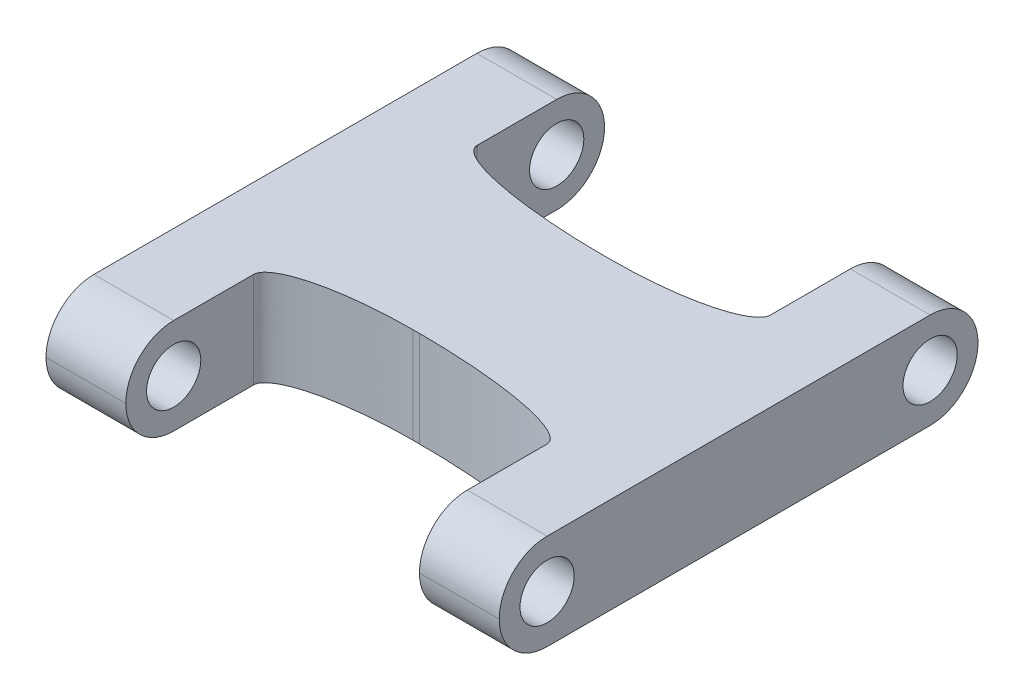
ISO-10303-21;
HEADER;
FILE_DESCRIPTION(('STEP AP214'),'2;1');
FILE_NAME('part.step','',(''),(''),'','','');
FILE_SCHEMA(('AUTOMOTIVE_DESIGN { 1 0 10303 214 1 1 1 1 }'));
ENDSEC;
DATA;
#1=APPLICATION_CONTEXT('core data for automotive mechanical design processes');
#2=APPLICATION_PROTOCOL_DEFINITION('international standard','automotive_design',2000,#1);
#3=PRODUCT_CONTEXT('',#1,'mechanical');
#4=PRODUCT('Part','Part','',(#3));
#5=PRODUCT_RELATED_PRODUCT_CATEGORY('part','',(#4));
#6=PRODUCT_DEFINITION_FORMATION('','',#4);
#7=PRODUCT_DEFINITION_CONTEXT('part definition',#1,'design');
#8=PRODUCT_DEFINITION('design','',#6,#7);
#9=PRODUCT_DEFINITION_SHAPE('','',#8);
#10=(LENGTH_UNIT() NAMED_UNIT(*) SI_UNIT(.MILLI.,.METRE.));
#11=(NAMED_UNIT(*) PLANE_ANGLE_UNIT() SI_UNIT($,.RADIAN.));
#12=(NAMED_UNIT(*) SI_UNIT($,.STERADIAN.) SOLID_ANGLE_UNIT());
#13=UNCERTAINTY_MEASURE_WITH_UNIT(LENGTH_MEASURE(1.E-05),#10,'distance_accuracy_value','');
#14=(GEOMETRIC_REPRESENTATION_CONTEXT(3) GLOBAL_UNCERTAINTY_ASSIGNED_CONTEXT((#13)) GLOBAL_UNIT_ASSIGNED_CONTEXT((#10,
#11,#12)) REPRESENTATION_CONTEXT('',''));
#15=CARTESIAN_POINT('',(0.,0.,0.));
#16=DIRECTION('',(0.,0.,1.));
#17=DIRECTION('',(1.,0.,0.));
#18=AXIS2_PLACEMENT_3D('',#15,#16,#17);
#19=CARTESIAN_POINT('',(5.,6.,-10.));
#20=DIRECTION('',(-1.,0.,0.));
#21=DIRECTION('',(0.,0.,1.));
#22=AXIS2_PLACEMENT_3D('',#19,#20,#21);
#23=PLANE('',#22);
#24=CARTESIAN_POINT('',(5.,3.,-3.00000000000001));
#25=DIRECTION('',(-1.,0.,0.));
#26=DIRECTION('',(0.,0.,1.));
#27=AXIS2_PLACEMENT_3D('',#24,#25,#26);
#28=CIRCLE('',#27,1.7);
#29=CARTESIAN_POINT('',(5.,3.,-1.3));
#30=VERTEX_POINT('',#29);
#31=EDGE_CURVE('E266',#30,#30,#28,.T.);
#32=ORIENTED_EDGE('',*,*,#31,.T.);
#33=EDGE_LOOP('',(#32));
#34=FACE_BOUND('',#33,.T.);
#35=DIRECTION('',(0.,0.,-1.));
#36=VECTOR('',#35,1.);
#37=CARTESIAN_POINT('',(5.,0.,-10.));
#38=LINE('',#37,#36);
#39=CARTESIAN_POINT('',(5.,0.,-3.));
#40=VERTEX_POINT('',#39);
#41=CARTESIAN_POINT('',(5.,0.,-8.));
#42=VERTEX_POINT('',#41);
#43=EDGE_CURVE('E256',#40,#42,#38,.T.);
#44=ORIENTED_EDGE('',*,*,#43,.T.);
#45=CARTESIAN_POINT('',(5.,6.3,-8.));
#46=CARTESIAN_POINT('',(5.,4.1,-8.));
#47=CARTESIAN_POINT('',(5.,1.9,-8.));
#48=CARTESIAN_POINT('',(5.,-0.3,-8.));
#49=(BOUNDED_CURVE() B_SPLINE_CURVE(3,(#45,#46,#47,#48),.UNSPECIFIED.,.F.,
.F.) B_SPLINE_CURVE_WITH_KNOTS((4,4),(-0.0063,0.0003),
.UNSPECIFIED.) CURVE() GEOMETRIC_REPRESENTATION_ITEM() RATIONAL_B_SPLINE_CURVE((1.,1.,1.,1.)) REPRESENTATION_ITEM(''));
#50=CARTESIAN_POINT('',(5.,6.,-8.));
#51=VERTEX_POINT('',#50);
#52=EDGE_CURVE('E339',#42,#51,#49,.F.);
#53=ORIENTED_EDGE('',*,*,#52,.T.);
#54=DIRECTION('',(0.,0.,-1.));
#55=VECTOR('',#54,1.);
#56=CARTESIAN_POINT('',(5.,6.,-10.));
#57=LINE('',#56,#55);
#58=CARTESIAN_POINT('',(5.,6.,-3.));
#59=VERTEX_POINT('',#58);
#60=EDGE_CURVE('E208',#59,#51,#57,.T.);
#61=ORIENTED_EDGE('',*,*,#60,.F.);
#62=CARTESIAN_POINT('',(5.,3.,-3.));
#63=DIRECTION('',(-1.,0.,0.));
#64=DIRECTION('',(0.,0.,1.));
#65=AXIS2_PLACEMENT_3D('',#62,#63,#64);
#66=CIRCLE('',#65,3.);
#67=CARTESIAN_POINT('',(5.,3.,0.));
#68=VERTEX_POINT('',#67);
#69=EDGE_CURVE('E244',#59,#68,#66,.F.);
#70=ORIENTED_EDGE('',*,*,#69,.T.);
#71=CARTESIAN_POINT('',(5.,3.,-3.));
#72=DIRECTION('',(-1.,0.,0.));
#73=DIRECTION('',(0.,0.,1.));
#74=AXIS2_PLACEMENT_3D('',#71,#72,#73);
#75=CIRCLE('',#74,3.);
#76=EDGE_CURVE('E246',#68,#40,#75,.F.);
#77=ORIENTED_EDGE('',*,*,#76,.T.);
#78=EDGE_LOOP('',(#44,#53,#61,#70,#77));
#79=FACE_BOUND('',#78,.T.);
#80=ADVANCED_FACE('F42',(#34,#79),#23,.F.);
#81=CARTESIAN_POINT('',(23.4,6.,-10.));
#82=DIRECTION('',(0.,0.,-1.));
#83=DIRECTION('',(-1.,0.,0.));
#84=AXIS2_PLACEMENT_3D('',#81,#82,#83);
#85=PLANE('',#84);
#86=DIRECTION('',(1.,0.,0.));
#87=VECTOR('',#86,1.);
#88=CARTESIAN_POINT('',(23.4,0.,-10.));
#89=LINE('',#88,#87);
#90=CARTESIAN_POINT('',(13.,0.,-10.));
#91=VERTEX_POINT('',#90);
#92=CARTESIAN_POINT('',(13.4,0.,-10.));
#93=VERTEX_POINT('',#92);
#94=EDGE_CURVE('E310',#91,#93,#89,.T.);
#95=ORIENTED_EDGE('',*,*,#94,.T.);
#96=CARTESIAN_POINT('',(13.4,6.3,-10.));
#97=CARTESIAN_POINT('',(13.4,4.1,-10.));
#98=CARTESIAN_POINT('',(13.4,1.9,-10.));
#99=CARTESIAN_POINT('',(13.4,-0.3,-10.));
#100=(BOUNDED_CURVE() B_SPLINE_CURVE(3,(#96,#97,#98,#99),.UNSPECIFIED.,.F.,
.F.) B_SPLINE_CURVE_WITH_KNOTS((4,4),(-0.0063,0.0003),
.UNSPECIFIED.) CURVE() GEOMETRIC_REPRESENTATION_ITEM() RATIONAL_B_SPLINE_CURVE((1.,1.,1.,1.)) REPRESENTATION_ITEM(''));
#101=CARTESIAN_POINT('',(13.4,6.,-10.));
#102=VERTEX_POINT('',#101);
#103=EDGE_CURVE('E70',#93,#102,#100,.F.);
#104=ORIENTED_EDGE('',*,*,#103,.T.);
#105=DIRECTION('',(1.,0.,0.));
#106=VECTOR('',#105,1.);
#107=CARTESIAN_POINT('',(23.4,6.,-10.));
#108=LINE('',#107,#106);
#109=CARTESIAN_POINT('',(13.,6.,-10.));
#110=VERTEX_POINT('',#109);
#111=EDGE_CURVE('E318',#110,#102,#108,.T.);
#112=ORIENTED_EDGE('',*,*,#111,.F.);
#113=CARTESIAN_POINT('',(13.,-0.3,-10.));
#114=CARTESIAN_POINT('',(13.,1.9,-10.));
#115=CARTESIAN_POINT('',(13.,4.1,-10.));
#116=CARTESIAN_POINT('',(13.,6.3,-10.));
#117=(BOUNDED_CURVE() B_SPLINE_CURVE(3,(#113,#114,#115,#116),.UNSPECIFIED.,.F.,
.F.) B_SPLINE_CURVE_WITH_KNOTS((4,4),(-0.0063,0.0003),
.UNSPECIFIED.) CURVE() GEOMETRIC_REPRESENTATION_ITEM() RATIONAL_B_SPLINE_CURVE((1.,1.,1.,1.)) REPRESENTATION_ITEM(''));
#118=EDGE_CURVE('E334',#110,#91,#117,.F.);
#119=ORIENTED_EDGE('',*,*,#118,.T.);
#120=EDGE_LOOP('',(#95,#104,#112,#119));
#121=FACE_BOUND('',#120,.T.);
#122=ADVANCED_FACE('F335',(#121),#85,.F.);
#123=CARTESIAN_POINT('',(23.4,6.,0.));
#124=DIRECTION('',(1.,0.,0.));
#125=DIRECTION('',(0.,0.,-1.));
#126=AXIS2_PLACEMENT_3D('',#123,#124,#125);
#127=PLANE('',#126);
#128=CARTESIAN_POINT('',(23.4,3.,-3.));
#129=DIRECTION('',(1.,0.,0.));
#130=DIRECTION('',(0.,0.,-1.));
#131=AXIS2_PLACEMENT_3D('',#128,#129,#130);
#132=CIRCLE('',#131,1.7);
#133=CARTESIAN_POINT('',(23.4,3.,-4.7));
#134=VERTEX_POINT('',#133);
#135=EDGE_CURVE('E693',#134,#134,#132,.T.);
#136=ORIENTED_EDGE('',*,*,#135,.T.);
#137=EDGE_LOOP('',(#136));
#138=FACE_BOUND('',#137,.T.);
#139=DIRECTION('',(0.,0.,1.));
#140=VECTOR('',#139,1.);
#141=CARTESIAN_POINT('',(23.4,6.,0.));
#142=LINE('',#141,#140);
#143=CARTESIAN_POINT('',(23.4,6.,-8.));
#144=VERTEX_POINT('',#143);
#145=CARTESIAN_POINT('',(23.4,6.,-3.));
#146=VERTEX_POINT('',#145);
#147=EDGE_CURVE('E330',#144,#146,#142,.T.);
#148=ORIENTED_EDGE('',*,*,#147,.F.);
#149=CARTESIAN_POINT('',(23.4,-0.3,-8.));
#150=CARTESIAN_POINT('',(23.4,1.9,-8.));
#151=CARTESIAN_POINT('',(23.4,4.1,-8.));
#152=CARTESIAN_POINT('',(23.4,6.3,-8.));
#153=(BOUNDED_CURVE() B_SPLINE_CURVE(3,(#149,#150,#151,#152),.UNSPECIFIED.,.F.,
.F.) B_SPLINE_CURVE_WITH_KNOTS((4,4),(-0.0063,0.0003),
.UNSPECIFIED.) CURVE() GEOMETRIC_REPRESENTATION_ITEM() RATIONAL_B_SPLINE_CURVE((1.,1.,1.,1.)) REPRESENTATION_ITEM(''));
#154=CARTESIAN_POINT('',(23.4,0.,-8.));
#155=VERTEX_POINT('',#154);
#156=EDGE_CURVE('E362',#144,#155,#153,.F.);
#157=ORIENTED_EDGE('',*,*,#156,.T.);
#158=DIRECTION('',(0.,0.,1.));
#159=VECTOR('',#158,1.);
#160=CARTESIAN_POINT('',(23.4,0.,0.));
#161=LINE('',#160,#159);
#162=CARTESIAN_POINT('',(23.4,0.,-3.));
#163=VERTEX_POINT('',#162);
#164=EDGE_CURVE('E343',#155,#163,#161,.T.);
#165=ORIENTED_EDGE('',*,*,#164,.T.);
#166=CARTESIAN_POINT('',(23.4,3.,-3.));
#167=DIRECTION('',(1.,0.,0.));
#168=DIRECTION('',(0.,0.,-1.));
#169=AXIS2_PLACEMENT_3D('',#166,#167,#168);
#170=CIRCLE('',#169,3.);
#171=CARTESIAN_POINT('',(23.4,3.,0.));
#172=VERTEX_POINT('',#171);
#173=EDGE_CURVE('E251',#163,#172,#170,.F.);
#174=ORIENTED_EDGE('',*,*,#173,.T.);
#175=CARTESIAN_POINT('',(23.4,3.,-3.));
#176=DIRECTION('',(1.,0.,0.));
#177=DIRECTION('',(0.,0.,-1.));
#178=AXIS2_PLACEMENT_3D('',#175,#176,#177);
#179=CIRCLE('',#178,3.);
#180=EDGE_CURVE('E248',#172,#146,#179,.F.);
#181=ORIENTED_EDGE('',*,*,#180,.T.);
#182=EDGE_LOOP('',(#148,#157,#165,#174,#181));
#183=FACE_BOUND('',#182,.T.);
#184=ADVANCED_FACE('F367',(#138,#183),#127,.F.);
#185=CARTESIAN_POINT('',(28.4,6.,-30.));
#186=DIRECTION('',(-1.,0.,0.));
#187=DIRECTION('',(0.,0.,1.));
#188=AXIS2_PLACEMENT_3D('',#185,#186,#187);
#189=PLANE('',#188);
#190=CARTESIAN_POINT('',(28.4,3.,-3.));
#191=DIRECTION('',(1.,0.,0.));
#192=DIRECTION('',(0.,0.,-1.));
#193=AXIS2_PLACEMENT_3D('',#190,#191,#192);
#194=CIRCLE('',#193,1.7);
#195=CARTESIAN_POINT('',(28.4,3.,-4.7));
#196=VERTEX_POINT('',#195);
#197=EDGE_CURVE('E710',#196,#196,#194,.T.);
#198=ORIENTED_EDGE('',*,*,#197,.F.);
#199=EDGE_LOOP('',(#198));
#200=FACE_BOUND('',#199,.T.);
#201=CARTESIAN_POINT('',(28.4,3.,-27.));
#202=DIRECTION('',(1.,0.,0.));
#203=DIRECTION('',(0.,0.,-1.));
#204=AXIS2_PLACEMENT_3D('',#201,#202,#203);
#205=CIRCLE('',#204,1.7);
#206=CARTESIAN_POINT('',(28.4,3.,-28.7));
#207=VERTEX_POINT('',#206);
#208=EDGE_CURVE('E707',#207,#207,#205,.T.);
#209=ORIENTED_EDGE('',*,*,#208,.F.);
#210=EDGE_LOOP('',(#209));
#211=FACE_BOUND('',#210,.T.);
#212=DIRECTION('',(0.,0.,-1.));
#213=VECTOR('',#212,1.);
#214=CARTESIAN_POINT('',(28.4,0.,-30.));
#215=LINE('',#214,#213);
#216=CARTESIAN_POINT('',(28.4,0.,-3.));
#217=VERTEX_POINT('',#216);
#218=CARTESIAN_POINT('',(28.4,0.,-27.));
#219=VERTEX_POINT('',#218);
#220=EDGE_CURVE('E344',#217,#219,#215,.T.);
#221=ORIENTED_EDGE('',*,*,#220,.T.);
#222=CARTESIAN_POINT('',(28.4,3.,-27.));
#223=DIRECTION('',(-1.,0.,0.));
#224=DIRECTION('',(0.,0.,1.));
#225=AXIS2_PLACEMENT_3D('',#222,#223,#224);
#226=CIRCLE('',#225,3.);
#227=CARTESIAN_POINT('',(28.4,3.,-30.));
#228=VERTEX_POINT('',#227);
#229=EDGE_CURVE('E242',#219,#228,#226,.F.);
#230=ORIENTED_EDGE('',*,*,#229,.T.);
#231=CARTESIAN_POINT('',(28.4,3.,-27.));
#232=DIRECTION('',(-1.,0.,0.));
#233=DIRECTION('',(0.,0.,1.));
#234=AXIS2_PLACEMENT_3D('',#231,#232,#233);
#235=CIRCLE('',#234,3.);
#236=CARTESIAN_POINT('',(28.4,6.,-27.));
#237=VERTEX_POINT('',#236);
#238=EDGE_CURVE('E240',#228,#237,#235,.F.);
#239=ORIENTED_EDGE('',*,*,#238,.T.);
#240=DIRECTION('',(0.,0.,-1.));
#241=VECTOR('',#240,1.);
#242=CARTESIAN_POINT('',(28.4,6.,-30.));
#243=LINE('',#242,#241);
#244=CARTESIAN_POINT('',(28.4,6.,-3.));
#245=VERTEX_POINT('',#244);
#246=EDGE_CURVE('E358',#245,#237,#243,.T.);
#247=ORIENTED_EDGE('',*,*,#246,.F.);
#248=CARTESIAN_POINT('',(28.4,3.,-3.));
#249=DIRECTION('',(-1.,0.,0.));
#250=DIRECTION('',(0.,0.,1.));
#251=AXIS2_PLACEMENT_3D('',#248,#249,#250);
#252=CIRCLE('',#251,3.);
#253=CARTESIAN_POINT('',(28.4,3.,0.));
#254=VERTEX_POINT('',#253);
#255=EDGE_CURVE('E236',#245,#254,#252,.F.);
#256=ORIENTED_EDGE('',*,*,#255,.T.);
#257=CARTESIAN_POINT('',(28.4,3.,-3.));
#258=DIRECTION('',(-1.,0.,0.));
#259=DIRECTION('',(0.,0.,1.));
#260=AXIS2_PLACEMENT_3D('',#257,#258,#259);
#261=CIRCLE('',#260,3.);
#262=EDGE_CURVE('E238',#254,#217,#261,.F.);
#263=ORIENTED_EDGE('',*,*,#262,.T.);
#264=EDGE_LOOP('',(#221,#230,#239,#247,#256,#263));
#265=FACE_BOUND('',#264,.T.);
#266=ADVANCED_FACE('F376',(#200,#211,#265),#189,.F.);
#267=CARTESIAN_POINT('',(23.4,6.,-20.));
#268=DIRECTION('',(1.,0.,0.));
#269=DIRECTION('',(0.,0.,-1.));
#270=AXIS2_PLACEMENT_3D('',#267,#268,#269);
#271=PLANE('',#270);
#272=CARTESIAN_POINT('',(23.4,3.,-27.));
#273=DIRECTION('',(1.,0.,0.));
#274=DIRECTION('',(0.,0.,-1.));
#275=AXIS2_PLACEMENT_3D('',#272,#273,#274);
#276=CIRCLE('',#275,1.7);
#277=CARTESIAN_POINT('',(23.4,3.,-28.7));
#278=VERTEX_POINT('',#277);
#279=EDGE_CURVE('E695',#278,#278,#276,.T.);
#280=ORIENTED_EDGE('',*,*,#279,.T.);
#281=EDGE_LOOP('',(#280));
#282=FACE_BOUND('',#281,.T.);
#283=DIRECTION('',(0.,0.,1.));
#284=VECTOR('',#283,1.);
#285=CARTESIAN_POINT('',(23.4,0.,-20.));
#286=LINE('',#285,#284);
#287=CARTESIAN_POINT('',(23.4,0.,-27.));
#288=VERTEX_POINT('',#287);
#289=CARTESIAN_POINT('',(23.4,0.,-22.));
#290=VERTEX_POINT('',#289);
#291=EDGE_CURVE('E271',#288,#290,#286,.T.);
#292=ORIENTED_EDGE('',*,*,#291,.T.);
#293=CARTESIAN_POINT('',(23.4,6.3,-22.));
#294=CARTESIAN_POINT('',(23.4,4.1,-22.));
#295=CARTESIAN_POINT('',(23.4,1.9,-22.));
#296=CARTESIAN_POINT('',(23.4,-0.3,-22.));
#297=(BOUNDED_CURVE() B_SPLINE_CURVE(3,(#293,#294,#295,#296),.UNSPECIFIED.,.F.,
.F.) B_SPLINE_CURVE_WITH_KNOTS((4,4),(-0.0063,0.0003),
.UNSPECIFIED.) CURVE() GEOMETRIC_REPRESENTATION_ITEM() RATIONAL_B_SPLINE_CURVE((1.,1.,1.,1.)) REPRESENTATION_ITEM(''));
#298=CARTESIAN_POINT('',(23.4,6.,-22.));
#299=VERTEX_POINT('',#298);
#300=EDGE_CURVE('E340',#290,#299,#297,.F.);
#301=ORIENTED_EDGE('',*,*,#300,.T.);
#302=DIRECTION('',(0.,0.,1.));
#303=VECTOR('',#302,1.);
#304=CARTESIAN_POINT('',(23.4,6.,-20.));
#305=LINE('',#304,#303);
#306=CARTESIAN_POINT('',(23.4,6.,-27.));
#307=VERTEX_POINT('',#306);
#308=EDGE_CURVE('E449',#307,#299,#305,.T.);
#309=ORIENTED_EDGE('',*,*,#308,.F.);
#310=CARTESIAN_POINT('',(23.4,3.,-27.));
#311=DIRECTION('',(1.,0.,0.));
#312=DIRECTION('',(0.,0.,-1.));
#313=AXIS2_PLACEMENT_3D('',#310,#311,#312);
#314=CIRCLE('',#313,3.);
#315=CARTESIAN_POINT('',(23.4,3.,-30.));
#316=VERTEX_POINT('',#315);
#317=EDGE_CURVE('E232',#307,#316,#314,.F.);
#318=ORIENTED_EDGE('',*,*,#317,.T.);
#319=CARTESIAN_POINT('',(23.4,3.,-27.));
#320=DIRECTION('',(1.,0.,0.));
#321=DIRECTION('',(0.,0.,-1.));
#322=AXIS2_PLACEMENT_3D('',#319,#320,#321);
#323=CIRCLE('',#322,3.);
#324=EDGE_CURVE('E234',#316,#288,#323,.F.);
#325=ORIENTED_EDGE('',*,*,#324,.T.);
#326=EDGE_LOOP('',(#292,#301,#309,#318,#325));
#327=FACE_BOUND('',#326,.T.);
#328=ADVANCED_FACE('F550',(#282,#327),#271,.F.);
#329=CARTESIAN_POINT('',(5.,6.,-20.));
#330=DIRECTION('',(0.,0.,1.));
#331=DIRECTION('',(1.,0.,0.));
#332=AXIS2_PLACEMENT_3D('',#329,#330,#331);
#333=PLANE('',#332);
#334=DIRECTION('',(-1.,0.,0.));
#335=VECTOR('',#334,1.);
#336=CARTESIAN_POINT('',(5.,0.,-20.));
#337=LINE('',#336,#335);
#338=CARTESIAN_POINT('',(15.4,0.,-20.));
#339=VERTEX_POINT('',#338);
#340=CARTESIAN_POINT('',(15.,0.,-20.));
#341=VERTEX_POINT('',#340);
#342=EDGE_CURVE('E267',#339,#341,#337,.T.);
#343=ORIENTED_EDGE('',*,*,#342,.T.);
#344=CARTESIAN_POINT('',(15.,6.3,-20.));
#345=CARTESIAN_POINT('',(15.,4.1,-20.));
#346=CARTESIAN_POINT('',(15.,1.9,-20.));
#347=CARTESIAN_POINT('',(15.,-0.3,-20.));
#348=(BOUNDED_CURVE() B_SPLINE_CURVE(3,(#344,#345,#346,#347),.UNSPECIFIED.,.F.,
.F.) B_SPLINE_CURVE_WITH_KNOTS((4,4),(-0.0063,0.0003),
.UNSPECIFIED.) CURVE() GEOMETRIC_REPRESENTATION_ITEM() RATIONAL_B_SPLINE_CURVE((1.,1.,1.,1.)) REPRESENTATION_ITEM(''));
#349=CARTESIAN_POINT('',(15.,6.,-20.));
#350=VERTEX_POINT('',#349);
#351=EDGE_CURVE('E459',#341,#350,#348,.F.);
#352=ORIENTED_EDGE('',*,*,#351,.T.);
#353=DIRECTION('',(-1.,0.,0.));
#354=VECTOR('',#353,1.);
#355=CARTESIAN_POINT('',(5.,6.,-20.));
#356=LINE('',#355,#354);
#357=CARTESIAN_POINT('',(15.4,6.,-20.));
#358=VERTEX_POINT('',#357);
#359=EDGE_CURVE('E272',#358,#350,#356,.T.);
#360=ORIENTED_EDGE('',*,*,#359,.F.);
#361=CARTESIAN_POINT('',(15.4,-0.3,-20.));
#362=CARTESIAN_POINT('',(15.4,1.9,-20.));
#363=CARTESIAN_POINT('',(15.4,4.1,-20.));
#364=CARTESIAN_POINT('',(15.4,6.3,-20.));
#365=(BOUNDED_CURVE() B_SPLINE_CURVE(3,(#361,#362,#363,#364),.UNSPECIFIED.,.F.,
.F.) B_SPLINE_CURVE_WITH_KNOTS((4,4),(-0.0063,0.0003),
.UNSPECIFIED.) CURVE() GEOMETRIC_REPRESENTATION_ITEM() RATIONAL_B_SPLINE_CURVE((1.,1.,1.,1.)) REPRESENTATION_ITEM(''));
#366=EDGE_CURVE('E253',#358,#339,#365,.F.);
#367=ORIENTED_EDGE('',*,*,#366,.T.);
#368=EDGE_LOOP('',(#343,#352,#360,#367));
#369=FACE_BOUND('',#368,.T.);
#370=ADVANCED_FACE('F457',(#369),#333,.F.);
#371=CARTESIAN_POINT('',(5.,6.,-30.));
#372=DIRECTION('',(-1.,0.,0.));
#373=DIRECTION('',(0.,0.,1.));
#374=AXIS2_PLACEMENT_3D('',#371,#372,#373);
#375=PLANE('',#374);
#376=CARTESIAN_POINT('',(5.,3.,-27.));
#377=DIRECTION('',(-1.,0.,0.));
#378=DIRECTION('',(0.,0.,1.));
#379=AXIS2_PLACEMENT_3D('',#376,#377,#378);
#380=CIRCLE('',#379,1.7);
#381=CARTESIAN_POINT('',(5.,3.,-25.3));
#382=VERTEX_POINT('',#381);
#383=EDGE_CURVE('E698',#382,#382,#380,.T.);
#384=ORIENTED_EDGE('',*,*,#383,.T.);
#385=EDGE_LOOP('',(#384));
#386=FACE_BOUND('',#385,.T.);
#387=DIRECTION('',(0.,0.,-1.));
#388=VECTOR('',#387,1.);
#389=CARTESIAN_POINT('',(5.,6.,-30.));
#390=LINE('',#389,#388);
#391=CARTESIAN_POINT('',(5.,6.,-22.));
#392=VERTEX_POINT('',#391);
#393=CARTESIAN_POINT('',(5.,6.,-27.));
#394=VERTEX_POINT('',#393);
#395=EDGE_CURVE('E289',#392,#394,#390,.T.);
#396=ORIENTED_EDGE('',*,*,#395,.F.);
#397=CARTESIAN_POINT('',(5.,-0.3,-22.));
#398=CARTESIAN_POINT('',(5.,1.9,-22.));
#399=CARTESIAN_POINT('',(5.,4.1,-22.));
#400=CARTESIAN_POINT('',(5.,6.3,-22.));
#401=(BOUNDED_CURVE() B_SPLINE_CURVE(3,(#397,#398,#399,#400),.UNSPECIFIED.,.F.,
.F.) B_SPLINE_CURVE_WITH_KNOTS((4,4),(-0.0063,0.0003),
.UNSPECIFIED.) CURVE() GEOMETRIC_REPRESENTATION_ITEM() RATIONAL_B_SPLINE_CURVE((1.,1.,1.,1.)) REPRESENTATION_ITEM(''));
#402=CARTESIAN_POINT('',(5.,0.,-22.));
#403=VERTEX_POINT('',#402);
#404=EDGE_CURVE('E592',#392,#403,#401,.F.);
#405=ORIENTED_EDGE('',*,*,#404,.T.);
#406=DIRECTION('',(0.,0.,-1.));
#407=VECTOR('',#406,1.);
#408=CARTESIAN_POINT('',(5.,0.,-30.));
#409=LINE('',#408,#407);
#410=CARTESIAN_POINT('',(5.,0.,-27.));
#411=VERTEX_POINT('',#410);
#412=EDGE_CURVE('E209',#403,#411,#409,.T.);
#413=ORIENTED_EDGE('',*,*,#412,.T.);
#414=CARTESIAN_POINT('',(5.,3.,-27.));
#415=DIRECTION('',(-1.,0.,0.));
#416=DIRECTION('',(0.,0.,1.));
#417=AXIS2_PLACEMENT_3D('',#414,#415,#416);
#418=CIRCLE('',#417,3.);
#419=CARTESIAN_POINT('',(5.,3.,-30.));
#420=VERTEX_POINT('',#419);
#421=EDGE_CURVE('E213',#411,#420,#418,.F.);
#422=ORIENTED_EDGE('',*,*,#421,.T.);
#423=CARTESIAN_POINT('',(5.,3.,-27.));
#424=DIRECTION('',(-1.,0.,0.));
#425=DIRECTION('',(0.,0.,1.));
#426=AXIS2_PLACEMENT_3D('',#423,#424,#425);
#427=CIRCLE('',#426,3.);
#428=EDGE_CURVE('E214',#420,#394,#427,.F.);
#429=ORIENTED_EDGE('',*,*,#428,.T.);
#430=EDGE_LOOP('',(#396,#405,#413,#422,#429));
#431=FACE_BOUND('',#430,.T.);
#432=ADVANCED_FACE('F607',(#386,#431),#375,.F.);
#433=CARTESIAN_POINT('',(0.,6.,0.));
#434=DIRECTION('',(1.,0.,0.));
#435=DIRECTION('',(0.,0.,-1.));
#436=AXIS2_PLACEMENT_3D('',#433,#434,#435);
#437=PLANE('',#436);
#438=CARTESIAN_POINT('',(0.,3.,-3.00000000000001));
#439=DIRECTION('',(1.,0.,0.));
#440=DIRECTION('',(0.,0.,-1.));
#441=AXIS2_PLACEMENT_3D('',#438,#439,#440);
#442=CIRCLE('',#441,1.7);
#443=CARTESIAN_POINT('',(0.,3.,-4.70000000000001));
#444=VERTEX_POINT('',#443);
#445=EDGE_CURVE('E703',#444,#444,#442,.T.);
#446=ORIENTED_EDGE('',*,*,#445,.T.);
#447=EDGE_LOOP('',(#446));
#448=FACE_BOUND('',#447,.T.);
#449=CARTESIAN_POINT('',(0.,3.,-27.));
#450=DIRECTION('',(1.,0.,0.));
#451=DIRECTION('',(0.,0.,-1.));
#452=AXIS2_PLACEMENT_3D('',#449,#450,#451);
#453=CIRCLE('',#452,1.7);
#454=CARTESIAN_POINT('',(0.,3.,-28.7));
#455=VERTEX_POINT('',#454);
#456=EDGE_CURVE('E704',#455,#455,#453,.T.);
#457=ORIENTED_EDGE('',*,*,#456,.T.);
#458=EDGE_LOOP('',(#457));
#459=FACE_BOUND('',#458,.T.);
#460=CARTESIAN_POINT('',(0.,3.,-27.));
#461=DIRECTION('',(1.,0.,0.));
#462=DIRECTION('',(0.,0.,-1.));
#463=AXIS2_PLACEMENT_3D('',#460,#461,#462);
#464=CIRCLE('',#463,3.);
#465=CARTESIAN_POINT('',(0.,6.,-27.));
#466=VERTEX_POINT('',#465);
#467=CARTESIAN_POINT('',(0.,3.,-30.));
#468=VERTEX_POINT('',#467);
#469=EDGE_CURVE('E193',#466,#468,#464,.F.);
#470=ORIENTED_EDGE('',*,*,#469,.T.);
#471=CARTESIAN_POINT('',(0.,3.,-27.));
#472=DIRECTION('',(1.,0.,0.));
#473=DIRECTION('',(0.,0.,-1.));
#474=AXIS2_PLACEMENT_3D('',#471,#472,#473);
#475=CIRCLE('',#474,3.);
#476=CARTESIAN_POINT('',(0.,0.,-27.));
#477=VERTEX_POINT('',#476);
#478=EDGE_CURVE('E187',#468,#477,#475,.F.);
#479=ORIENTED_EDGE('',*,*,#478,.T.);
#480=DIRECTION('',(0.,0.,1.));
#481=VECTOR('',#480,1.);
#482=CARTESIAN_POINT('',(0.,0.,0.));
#483=LINE('',#482,#481);
#484=CARTESIAN_POINT('',(0.,0.,-3.));
#485=VERTEX_POINT('',#484);
#486=EDGE_CURVE('E190',#477,#485,#483,.T.);
#487=ORIENTED_EDGE('',*,*,#486,.T.);
#488=CARTESIAN_POINT('',(0.,3.,-3.));
#489=DIRECTION('',(1.,0.,0.));
#490=DIRECTION('',(0.,0.,-1.));
#491=AXIS2_PLACEMENT_3D('',#488,#489,#490);
#492=CIRCLE('',#491,3.);
#493=CARTESIAN_POINT('',(0.,3.,0.));
#494=VERTEX_POINT('',#493);
#495=EDGE_CURVE('E582',#485,#494,#492,.F.);
#496=ORIENTED_EDGE('',*,*,#495,.T.);
#497=CARTESIAN_POINT('',(0.,3.,-3.));
#498=DIRECTION('',(1.,0.,0.));
#499=DIRECTION('',(0.,0.,-1.));
#500=AXIS2_PLACEMENT_3D('',#497,#498,#499);
#501=CIRCLE('',#500,3.);
#502=CARTESIAN_POINT('',(0.,6.,-3.));
#503=VERTEX_POINT('',#502);
#504=EDGE_CURVE('E301',#494,#503,#501,.F.);
#505=ORIENTED_EDGE('',*,*,#504,.T.);
#506=DIRECTION('',(0.,0.,1.));
#507=VECTOR('',#506,1.);
#508=CARTESIAN_POINT('',(0.,6.,0.));
#509=LINE('',#508,#507);
#510=EDGE_CURVE('E292',#466,#503,#509,.T.);
#511=ORIENTED_EDGE('',*,*,#510,.F.);
#512=EDGE_LOOP('',(#470,#479,#487,#496,#505,#511));
#513=FACE_BOUND('',#512,.T.);
#514=ADVANCED_FACE('F189',(#448,#459,#513),#437,.F.);
#515=CARTESIAN_POINT('',(0.,6.,0.));
#516=DIRECTION('',(0.,-1.,0.));
#517=DIRECTION('',(0.,0.,-1.));
#518=AXIS2_PLACEMENT_3D('',#515,#516,#517);
#519=PLANE('',#518);
#520=ORIENTED_EDGE('',*,*,#359,.T.);
#521=CARTESIAN_POINT('',(5.,6.,-22.));
#522=CARTESIAN_POINT('',(5.,6.,-20.));
#523=CARTESIAN_POINT('',(15.,6.,-20.));
#524=(BOUNDED_CURVE() B_SPLINE_CURVE(2,(#521,#522,#523),.UNSPECIFIED.,.F.,
.F.) B_SPLINE_CURVE_WITH_KNOTS((3,3),(0.,1.),
.UNSPECIFIED.) CURVE() GEOMETRIC_REPRESENTATION_ITEM() RATIONAL_B_SPLINE_CURVE((1.,
0.707106781186548,1.)) REPRESENTATION_ITEM(''));
#525=EDGE_CURVE('E604',#350,#392,#524,.F.);
#526=ORIENTED_EDGE('',*,*,#525,.T.);
#527=ORIENTED_EDGE('',*,*,#395,.T.);
#528=DIRECTION('',(-1.,0.,0.));
#529=VECTOR('',#528,1.);
#530=CARTESIAN_POINT('',(0.,6.,-27.));
#531=LINE('',#530,#529);
#532=EDGE_CURVE('E230',#394,#466,#531,.T.);
#533=ORIENTED_EDGE('',*,*,#532,.T.);
#534=ORIENTED_EDGE('',*,*,#510,.T.);
#535=DIRECTION('',(1.,0.,0.));
#536=VECTOR('',#535,1.);
#537=CARTESIAN_POINT('',(0.,6.,-3.));
#538=LINE('',#537,#536);
#539=EDGE_CURVE('E226',#503,#59,#538,.T.);
#540=ORIENTED_EDGE('',*,*,#539,.T.);
#541=ORIENTED_EDGE('',*,*,#60,.T.);
#542=CARTESIAN_POINT('',(13.,6.,-10.));
#543=CARTESIAN_POINT('',(5.,6.,-9.99999999999999));
#544=CARTESIAN_POINT('',(5.,6.,-8.));
#545=(BOUNDED_CURVE() B_SPLINE_CURVE(2,(#542,#543,#544),.UNSPECIFIED.,.F.,
.F.) B_SPLINE_CURVE_WITH_KNOTS((3,3),(0.,1.),
.UNSPECIFIED.) CURVE() GEOMETRIC_REPRESENTATION_ITEM() RATIONAL_B_SPLINE_CURVE((1.,
0.707106781186548,1.)) REPRESENTATION_ITEM(''));
#546=EDGE_CURVE('E536',#51,#110,#545,.F.);
#547=ORIENTED_EDGE('',*,*,#546,.T.);
#548=ORIENTED_EDGE('',*,*,#111,.T.);
#549=CARTESIAN_POINT('',(23.4,6.,-8.));
#550=CARTESIAN_POINT('',(23.4,6.,-10.));
#551=CARTESIAN_POINT('',(13.4,6.,-10.));
#552=(BOUNDED_CURVE() B_SPLINE_CURVE(2,(#549,#550,#551),.UNSPECIFIED.,.F.,
.F.) B_SPLINE_CURVE_WITH_KNOTS((3,3),(0.,1.),
.UNSPECIFIED.) CURVE() GEOMETRIC_REPRESENTATION_ITEM() RATIONAL_B_SPLINE_CURVE((1.,
0.707106781186548,1.)) REPRESENTATION_ITEM(''));
#553=EDGE_CURVE('E12',#102,#144,#552,.F.);
#554=ORIENTED_EDGE('',*,*,#553,.T.);
#555=ORIENTED_EDGE('',*,*,#147,.T.);
#556=DIRECTION('',(1.,0.,0.));
#557=VECTOR('',#556,1.);
#558=CARTESIAN_POINT('',(0.,6.,-3.));
#559=LINE('',#558,#557);
#560=EDGE_CURVE('E224',#146,#245,#559,.T.);
#561=ORIENTED_EDGE('',*,*,#560,.T.);
#562=ORIENTED_EDGE('',*,*,#246,.T.);
#563=DIRECTION('',(-1.,0.,0.));
#564=VECTOR('',#563,1.);
#565=CARTESIAN_POINT('',(0.,6.,-27.));
#566=LINE('',#565,#564);
#567=EDGE_CURVE('E228',#237,#307,#566,.T.);
#568=ORIENTED_EDGE('',*,*,#567,.T.);
#569=ORIENTED_EDGE('',*,*,#308,.T.);
#570=CARTESIAN_POINT('',(15.4,6.,-20.));
#571=CARTESIAN_POINT('',(23.4,6.,-20.));
#572=CARTESIAN_POINT('',(23.4,6.,-22.));
#573=(BOUNDED_CURVE() B_SPLINE_CURVE(2,(#570,#571,#572),.UNSPECIFIED.,.F.,
.F.) B_SPLINE_CURVE_WITH_KNOTS((3,3),(0.,1.),
.UNSPECIFIED.) CURVE() GEOMETRIC_REPRESENTATION_ITEM() RATIONAL_B_SPLINE_CURVE((1.,
0.707106781186547,1.)) REPRESENTATION_ITEM(''));
#574=EDGE_CURVE('E438',#299,#358,#573,.F.);
#575=ORIENTED_EDGE('',*,*,#574,.T.);
#576=EDGE_LOOP('',(#520,#526,#527,#533,#534,#540,#541,#547,#548,#554,#555,#561,#562,#568,#569,#575));
#577=FACE_BOUND('',#576,.T.);
#578=ADVANCED_FACE('F411',(#577),#519,.F.);
#579=CARTESIAN_POINT('',(0.,0.,0.));
#580=DIRECTION('',(0.,-1.,0.));
#581=DIRECTION('',(0.,0.,-1.));
#582=AXIS2_PLACEMENT_3D('',#579,#580,#581);
#583=PLANE('',#582);
#584=ORIENTED_EDGE('',*,*,#486,.F.);
#585=DIRECTION('',(-1.,0.,0.));
#586=VECTOR('',#585,1.);
#587=CARTESIAN_POINT('',(5.,0.,-27.));
#588=LINE('',#587,#586);
#589=EDGE_CURVE('E204',#477,#411,#588,.F.);
#590=ORIENTED_EDGE('',*,*,#589,.T.);
#591=ORIENTED_EDGE('',*,*,#412,.F.);
#592=CARTESIAN_POINT('',(15.,0.,-20.));
#593=CARTESIAN_POINT('',(5.,0.,-20.));
#594=CARTESIAN_POINT('',(5.,0.,-22.));
#595=(BOUNDED_CURVE() B_SPLINE_CURVE(2,(#592,#593,#594),.UNSPECIFIED.,.F.,
.F.) B_SPLINE_CURVE_WITH_KNOTS((3,3),(0.,1.),
.UNSPECIFIED.) CURVE() GEOMETRIC_REPRESENTATION_ITEM() RATIONAL_B_SPLINE_CURVE((1.,
0.707106781186548,1.)) REPRESENTATION_ITEM(''));
#596=EDGE_CURVE('E395',#403,#341,#595,.F.);
#597=ORIENTED_EDGE('',*,*,#596,.T.);
#598=ORIENTED_EDGE('',*,*,#342,.F.);
#599=CARTESIAN_POINT('',(23.4,0.,-22.));
#600=CARTESIAN_POINT('',(23.4,0.,-20.));
#601=CARTESIAN_POINT('',(15.4,0.,-20.));
#602=(BOUNDED_CURVE() B_SPLINE_CURVE(2,(#599,#600,#601),.UNSPECIFIED.,.F.,
.F.) B_SPLINE_CURVE_WITH_KNOTS((3,3),(0.,1.),
.UNSPECIFIED.) CURVE() GEOMETRIC_REPRESENTATION_ITEM() RATIONAL_B_SPLINE_CURVE((1.,
0.707106781186547,1.)) REPRESENTATION_ITEM(''));
#603=EDGE_CURVE('E454',#339,#290,#602,.F.);
#604=ORIENTED_EDGE('',*,*,#603,.T.);
#605=ORIENTED_EDGE('',*,*,#291,.F.);
#606=DIRECTION('',(-1.,0.,0.));
#607=VECTOR('',#606,1.);
#608=CARTESIAN_POINT('',(28.4,0.,-27.));
#609=LINE('',#608,#607);
#610=EDGE_CURVE('E215',#288,#219,#609,.F.);
#611=ORIENTED_EDGE('',*,*,#610,.T.);
#612=ORIENTED_EDGE('',*,*,#220,.F.);
#613=DIRECTION('',(1.,0.,0.));
#614=VECTOR('',#613,1.);
#615=CARTESIAN_POINT('',(23.4,0.,-3.));
#616=LINE('',#615,#614);
#617=EDGE_CURVE('E198',#217,#163,#616,.F.);
#618=ORIENTED_EDGE('',*,*,#617,.T.);
#619=ORIENTED_EDGE('',*,*,#164,.F.);
#620=CARTESIAN_POINT('',(13.4,0.,-10.));
#621=CARTESIAN_POINT('',(23.4,0.,-10.));
#622=CARTESIAN_POINT('',(23.4,0.,-8.));
#623=(BOUNDED_CURVE() B_SPLINE_CURVE(2,(#620,#621,#622),.UNSPECIFIED.,.F.,
.F.) B_SPLINE_CURVE_WITH_KNOTS((3,3),(0.,1.),
.UNSPECIFIED.) CURVE() GEOMETRIC_REPRESENTATION_ITEM() RATIONAL_B_SPLINE_CURVE((1.,
0.707106781186548,1.)) REPRESENTATION_ITEM(''));
#624=EDGE_CURVE('E56',#155,#93,#623,.F.);
#625=ORIENTED_EDGE('',*,*,#624,.T.);
#626=ORIENTED_EDGE('',*,*,#94,.F.);
#627=CARTESIAN_POINT('',(5.,0.,-8.));
#628=CARTESIAN_POINT('',(5.,0.,-9.99999999999999));
#629=CARTESIAN_POINT('',(13.,0.,-10.));
#630=(BOUNDED_CURVE() B_SPLINE_CURVE(2,(#627,#628,#629),.UNSPECIFIED.,.F.,
.F.) B_SPLINE_CURVE_WITH_KNOTS((3,3),(0.,1.),
.UNSPECIFIED.) CURVE() GEOMETRIC_REPRESENTATION_ITEM() RATIONAL_B_SPLINE_CURVE((1.,
0.707106781186548,1.)) REPRESENTATION_ITEM(''));
#631=EDGE_CURVE('E341',#91,#42,#630,.F.);
#632=ORIENTED_EDGE('',*,*,#631,.T.);
#633=ORIENTED_EDGE('',*,*,#43,.F.);
#634=DIRECTION('',(1.,0.,0.));
#635=VECTOR('',#634,1.);
#636=CARTESIAN_POINT('',(0.,0.,-3.));
#637=LINE('',#636,#635);
#638=EDGE_CURVE('E207',#40,#485,#637,.F.);
#639=ORIENTED_EDGE('',*,*,#638,.T.);
#640=EDGE_LOOP('',(#584,#590,#591,#597,#598,#604,#605,#611,#612,#618,#619,#625,#626,#632,#633,#639));
#641=FACE_BOUND('',#640,.T.);
#642=ADVANCED_FACE('F202',(#641),#583,.T.);
#643=CARTESIAN_POINT('',(0.,3.,-27.));
#644=DIRECTION('',(-1.,0.,0.));
#645=DIRECTION('',(0.,0.,1.));
#646=AXIS2_PLACEMENT_3D('',#643,#644,#645);
#647=CYLINDRICAL_SURFACE('',#646,3.);
#648=ORIENTED_EDGE('',*,*,#532,.F.);
#649=ORIENTED_EDGE('',*,*,#428,.F.);
#650=DIRECTION('',(-1.,0.,0.));
#651=VECTOR('',#650,1.);
#652=CARTESIAN_POINT('',(0.,3.,-30.));
#653=LINE('',#652,#651);
#654=EDGE_CURVE('E254',#468,#420,#653,.F.);
#655=ORIENTED_EDGE('',*,*,#654,.F.);
#656=ORIENTED_EDGE('',*,*,#469,.F.);
#657=EDGE_LOOP('',(#648,#649,#655,#656));
#658=FACE_BOUND('',#657,.T.);
#659=ADVANCED_FACE('F410',(#658),#647,.T.);
#660=CARTESIAN_POINT('',(0.,3.,-27.));
#661=DIRECTION('',(1.,0.,0.));
#662=DIRECTION('',(0.,0.,-1.));
#663=AXIS2_PLACEMENT_3D('',#660,#661,#662);
#664=CYLINDRICAL_SURFACE('',#663,3.);
#665=ORIENTED_EDGE('',*,*,#421,.F.);
#666=ORIENTED_EDGE('',*,*,#589,.F.);
#667=ORIENTED_EDGE('',*,*,#478,.F.);
#668=ORIENTED_EDGE('',*,*,#654,.T.);
#669=EDGE_LOOP('',(#665,#666,#667,#668));
#670=FACE_BOUND('',#669,.T.);
#671=ADVANCED_FACE('F212',(#670),#664,.T.);
#672=CARTESIAN_POINT('',(0.,3.,-27.));
#673=DIRECTION('',(-1.,0.,0.));
#674=DIRECTION('',(0.,0.,1.));
#675=AXIS2_PLACEMENT_3D('',#672,#673,#674);
#676=CYLINDRICAL_SURFACE('',#675,3.);
#677=ORIENTED_EDGE('',*,*,#567,.F.);
#678=ORIENTED_EDGE('',*,*,#238,.F.);
#679=DIRECTION('',(-1.,0.,0.));
#680=VECTOR('',#679,1.);
#681=CARTESIAN_POINT('',(23.4,3.,-30.));
#682=LINE('',#681,#680);
#683=EDGE_CURVE('E257',#316,#228,#682,.F.);
#684=ORIENTED_EDGE('',*,*,#683,.F.);
#685=ORIENTED_EDGE('',*,*,#317,.F.);
#686=EDGE_LOOP('',(#677,#678,#684,#685));
#687=FACE_BOUND('',#686,.T.);
#688=ADVANCED_FACE('F568',(#687),#676,.T.);
#689=CARTESIAN_POINT('',(23.4,3.,-27.));
#690=DIRECTION('',(1.,0.,0.));
#691=DIRECTION('',(0.,0.,-1.));
#692=AXIS2_PLACEMENT_3D('',#689,#690,#691);
#693=CYLINDRICAL_SURFACE('',#692,3.);
#694=ORIENTED_EDGE('',*,*,#229,.F.);
#695=ORIENTED_EDGE('',*,*,#610,.F.);
#696=ORIENTED_EDGE('',*,*,#324,.F.);
#697=ORIENTED_EDGE('',*,*,#683,.T.);
#698=EDGE_LOOP('',(#694,#695,#696,#697));
#699=FACE_BOUND('',#698,.T.);
#700=ADVANCED_FACE('F571',(#699),#693,.T.);
#701=CARTESIAN_POINT('',(0.,3.,-3.));
#702=DIRECTION('',(1.,0.,0.));
#703=DIRECTION('',(0.,0.,-1.));
#704=AXIS2_PLACEMENT_3D('',#701,#702,#703);
#705=CYLINDRICAL_SURFACE('',#704,3.);
#706=ORIENTED_EDGE('',*,*,#539,.F.);
#707=ORIENTED_EDGE('',*,*,#504,.F.);
#708=DIRECTION('',(1.,0.,0.));
#709=VECTOR('',#708,1.);
#710=CARTESIAN_POINT('',(5.,3.,0.));
#711=LINE('',#710,#709);
#712=EDGE_CURVE('E260',#68,#494,#711,.F.);
#713=ORIENTED_EDGE('',*,*,#712,.F.);
#714=ORIENTED_EDGE('',*,*,#69,.F.);
#715=EDGE_LOOP('',(#706,#707,#713,#714));
#716=FACE_BOUND('',#715,.T.);
#717=ADVANCED_FACE('F589',(#716),#705,.T.);
#718=CARTESIAN_POINT('',(5.,3.,-3.));
#719=DIRECTION('',(-1.,0.,0.));
#720=DIRECTION('',(0.,0.,1.));
#721=AXIS2_PLACEMENT_3D('',#718,#719,#720);
#722=CYLINDRICAL_SURFACE('',#721,3.);
#723=ORIENTED_EDGE('',*,*,#495,.F.);
#724=ORIENTED_EDGE('',*,*,#638,.F.);
#725=ORIENTED_EDGE('',*,*,#76,.F.);
#726=ORIENTED_EDGE('',*,*,#712,.T.);
#727=EDGE_LOOP('',(#723,#724,#725,#726));
#728=FACE_BOUND('',#727,.T.);
#729=ADVANCED_FACE('F811',(#728),#722,.T.);
#730=CARTESIAN_POINT('',(0.,3.,-3.));
#731=DIRECTION('',(1.,0.,0.));
#732=DIRECTION('',(0.,0.,-1.));
#733=AXIS2_PLACEMENT_3D('',#730,#731,#732);
#734=CYLINDRICAL_SURFACE('',#733,3.);
#735=ORIENTED_EDGE('',*,*,#560,.F.);
#736=ORIENTED_EDGE('',*,*,#180,.F.);
#737=DIRECTION('',(1.,0.,0.));
#738=VECTOR('',#737,1.);
#739=CARTESIAN_POINT('',(28.4,3.,0.));
#740=LINE('',#739,#738);
#741=EDGE_CURVE('E263',#254,#172,#740,.F.);
#742=ORIENTED_EDGE('',*,*,#741,.F.);
#743=ORIENTED_EDGE('',*,*,#255,.F.);
#744=EDGE_LOOP('',(#735,#736,#742,#743));
#745=FACE_BOUND('',#744,.T.);
#746=ADVANCED_FACE('F487',(#745),#734,.T.);
#747=CARTESIAN_POINT('',(28.4,3.,-3.));
#748=DIRECTION('',(-1.,0.,0.));
#749=DIRECTION('',(0.,0.,1.));
#750=AXIS2_PLACEMENT_3D('',#747,#748,#749);
#751=CYLINDRICAL_SURFACE('',#750,3.);
#752=ORIENTED_EDGE('',*,*,#173,.F.);
#753=ORIENTED_EDGE('',*,*,#617,.F.);
#754=ORIENTED_EDGE('',*,*,#262,.F.);
#755=ORIENTED_EDGE('',*,*,#741,.T.);
#756=EDGE_LOOP('',(#752,#753,#754,#755));
#757=FACE_BOUND('',#756,.T.);
#758=ADVANCED_FACE('F578',(#757),#751,.T.);
#759=CARTESIAN_POINT('',(0.,3.,-27.));
#760=DIRECTION('',(1.,0.,0.));
#761=DIRECTION('',(0.,0.,-1.));
#762=AXIS2_PLACEMENT_3D('',#759,#760,#761);
#763=CYLINDRICAL_SURFACE('',#762,1.7);
#764=ORIENTED_EDGE('',*,*,#456,.F.);
#765=EDGE_LOOP('',(#764));
#766=FACE_BOUND('',#765,.T.);
#767=ORIENTED_EDGE('',*,*,#383,.F.);
#768=EDGE_LOOP('',(#767));
#769=FACE_BOUND('',#768,.T.);
#770=ADVANCED_FACE('F721',(#766,#769),#763,.F.);
#771=CARTESIAN_POINT('',(0.,3.,-3.00000000000001));
#772=DIRECTION('',(1.,0.,0.));
#773=DIRECTION('',(0.,0.,-1.));
#774=AXIS2_PLACEMENT_3D('',#771,#772,#773);
#775=CYLINDRICAL_SURFACE('',#774,1.7);
#776=ORIENTED_EDGE('',*,*,#445,.F.);
#777=EDGE_LOOP('',(#776));
#778=FACE_BOUND('',#777,.T.);
#779=ORIENTED_EDGE('',*,*,#31,.F.);
#780=EDGE_LOOP('',(#779));
#781=FACE_BOUND('',#780,.T.);
#782=ADVANCED_FACE('F718',(#778,#781),#775,.F.);
#783=ORIENTED_EDGE('',*,*,#208,.T.);
#784=EDGE_LOOP('',(#783));
#785=FACE_BOUND('',#784,.T.);
#786=ORIENTED_EDGE('',*,*,#279,.F.);
#787=EDGE_LOOP('',(#786));
#788=FACE_BOUND('',#787,.T.);
#789=ADVANCED_FACE('F720',(#785,#788),#763,.F.);
#790=ORIENTED_EDGE('',*,*,#197,.T.);
#791=EDGE_LOOP('',(#790));
#792=FACE_BOUND('',#791,.T.);
#793=ORIENTED_EDGE('',*,*,#135,.F.);
#794=EDGE_LOOP('',(#793));
#795=FACE_BOUND('',#794,.T.);
#796=ADVANCED_FACE('F486',(#792,#795),#775,.F.);
#797=CARTESIAN_POINT('',(23.4,-0.3,-22.));
#798=CARTESIAN_POINT('',(23.4,1.9,-22.));
#799=CARTESIAN_POINT('',(23.4,4.1,-22.));
#800=CARTESIAN_POINT('',(23.4,6.3,-22.));
#801=CARTESIAN_POINT('',(23.4,-0.3,-20.));
#802=CARTESIAN_POINT('',(23.4,1.9,-20.));
#803=CARTESIAN_POINT('',(23.4,4.1,-20.));
#804=CARTESIAN_POINT('',(23.4,6.3,-20.));
#805=CARTESIAN_POINT('',(15.4,-0.3,-20.));
#806=CARTESIAN_POINT('',(15.4,1.9,-20.));
#807=CARTESIAN_POINT('',(15.4,4.1,-20.));
#808=CARTESIAN_POINT('',(15.4,6.3,-20.));
#809=(BOUNDED_SURFACE() B_SPLINE_SURFACE(2,3,((#797,#798,#799,#800),(#801,#802,#803,#804),(#805,
#806,#807,#808)),.UNSPECIFIED.,.F.,.F.,.F.) B_SPLINE_SURFACE_WITH_KNOTS((3,3),(4,4),(0.,1.),
(-0.0063,0.0003),.UNSPECIFIED.) GEOMETRIC_REPRESENTATION_ITEM() RATIONAL_B_SPLINE_SURFACE(((1.,
1.,1.,1.),(0.707106781186547,0.707106781186547,0.707106781186547,0.707106781186547),(1.,1.,1.,1.))) REPRESENTATION_ITEM('') SURFACE());
#810=ORIENTED_EDGE('',*,*,#574,.F.);
#811=ORIENTED_EDGE('',*,*,#300,.F.);
#812=ORIENTED_EDGE('',*,*,#603,.F.);
#813=ORIENTED_EDGE('',*,*,#366,.F.);
#814=EDGE_LOOP('',(#810,#811,#812,#813));
#815=FACE_BOUND('',#814,.T.);
#816=ADVANCED_FACE('F461',(#815),#809,.T.);
#817=CARTESIAN_POINT('',(5.,-0.3,-8.));
#818=CARTESIAN_POINT('',(5.,1.9,-8.));
#819=CARTESIAN_POINT('',(5.,4.1,-8.));
#820=CARTESIAN_POINT('',(5.,6.3,-8.));
#821=CARTESIAN_POINT('',(5.,-0.3,-9.99999999999999));
#822=CARTESIAN_POINT('',(5.,1.9,-9.99999999999999));
#823=CARTESIAN_POINT('',(5.,4.1,-9.99999999999999));
#824=CARTESIAN_POINT('',(5.,6.3,-9.99999999999999));
#825=CARTESIAN_POINT('',(13.,-0.3,-10.));
#826=CARTESIAN_POINT('',(13.,1.9,-10.));
#827=CARTESIAN_POINT('',(13.,4.1,-10.));
#828=CARTESIAN_POINT('',(13.,6.3,-10.));
#829=(BOUNDED_SURFACE() B_SPLINE_SURFACE(2,3,((#817,#818,#819,#820),(#821,#822,#823,#824),(#825,
#826,#827,#828)),.UNSPECIFIED.,.F.,.F.,.F.) B_SPLINE_SURFACE_WITH_KNOTS((3,3),(4,4),(0.,1.),
(-0.0063,0.0003),.UNSPECIFIED.) GEOMETRIC_REPRESENTATION_ITEM() RATIONAL_B_SPLINE_SURFACE(((1.,
1.,1.,1.),(0.707106781186548,0.707106781186548,0.707106781186548,0.707106781186548),(1.,1.,1.,1.))) REPRESENTATION_ITEM('') SURFACE());
#830=ORIENTED_EDGE('',*,*,#546,.F.);
#831=ORIENTED_EDGE('',*,*,#52,.F.);
#832=ORIENTED_EDGE('',*,*,#631,.F.);
#833=ORIENTED_EDGE('',*,*,#118,.F.);
#834=EDGE_LOOP('',(#830,#831,#832,#833));
#835=FACE_BOUND('',#834,.T.);
#836=ADVANCED_FACE('F485',(#835),#829,.T.);
#837=CARTESIAN_POINT('',(15.,-0.3,-20.));
#838=CARTESIAN_POINT('',(15.,1.9,-20.));
#839=CARTESIAN_POINT('',(15.,4.1,-20.));
#840=CARTESIAN_POINT('',(15.,6.3,-20.));
#841=CARTESIAN_POINT('',(5.,-0.3,-20.));
#842=CARTESIAN_POINT('',(5.,1.9,-20.));
#843=CARTESIAN_POINT('',(5.,4.1,-20.));
#844=CARTESIAN_POINT('',(5.,6.3,-20.));
#845=CARTESIAN_POINT('',(5.,-0.3,-22.));
#846=CARTESIAN_POINT('',(5.,1.9,-22.));
#847=CARTESIAN_POINT('',(5.,4.1,-22.));
#848=CARTESIAN_POINT('',(5.,6.3,-22.));
#849=(BOUNDED_SURFACE() B_SPLINE_SURFACE(2,3,((#837,#838,#839,#840),(#841,#842,#843,#844),(#845,
#846,#847,#848)),.UNSPECIFIED.,.F.,.F.,.F.) B_SPLINE_SURFACE_WITH_KNOTS((3,3),(4,4),(0.,1.),
(-0.0063,0.0003),.UNSPECIFIED.) GEOMETRIC_REPRESENTATION_ITEM() RATIONAL_B_SPLINE_SURFACE(((1.,
1.,1.,1.),(0.707106781186548,0.707106781186548,0.707106781186548,0.707106781186548),(1.,1.,1.,1.))) REPRESENTATION_ITEM('') SURFACE());
#850=ORIENTED_EDGE('',*,*,#525,.F.);
#851=ORIENTED_EDGE('',*,*,#351,.F.);
#852=ORIENTED_EDGE('',*,*,#596,.F.);
#853=ORIENTED_EDGE('',*,*,#404,.F.);
#854=EDGE_LOOP('',(#850,#851,#852,#853));
#855=FACE_BOUND('',#854,.T.);
#856=ADVANCED_FACE('F610',(#855),#849,.T.);
#857=CARTESIAN_POINT('',(13.4,-0.3,-10.));
#858=CARTESIAN_POINT('',(13.4,1.9,-10.));
#859=CARTESIAN_POINT('',(13.4,4.1,-10.));
#860=CARTESIAN_POINT('',(13.4,6.3,-10.));
#861=CARTESIAN_POINT('',(23.4,-0.3,-10.));
#862=CARTESIAN_POINT('',(23.4,1.9,-10.));
#863=CARTESIAN_POINT('',(23.4,4.1,-10.));
#864=CARTESIAN_POINT('',(23.4,6.3,-10.));
#865=CARTESIAN_POINT('',(23.4,-0.3,-8.));
#866=CARTESIAN_POINT('',(23.4,1.9,-8.));
#867=CARTESIAN_POINT('',(23.4,4.1,-8.));
#868=CARTESIAN_POINT('',(23.4,6.3,-8.));
#869=(BOUNDED_SURFACE() B_SPLINE_SURFACE(2,3,((#857,#858,#859,#860),(#861,#862,#863,#864),(#865,
#866,#867,#868)),.UNSPECIFIED.,.F.,.F.,.F.) B_SPLINE_SURFACE_WITH_KNOTS((3,3),(4,4),(0.,1.),
(-0.0063,0.0003),.UNSPECIFIED.) GEOMETRIC_REPRESENTATION_ITEM() RATIONAL_B_SPLINE_SURFACE(((1.,
1.,1.,1.),(0.707106781186548,0.707106781186548,0.707106781186548,0.707106781186548),(1.,1.,1.,1.))) REPRESENTATION_ITEM('') SURFACE());
#870=ORIENTED_EDGE('',*,*,#553,.F.);
#871=ORIENTED_EDGE('',*,*,#103,.F.);
#872=ORIENTED_EDGE('',*,*,#624,.F.);
#873=ORIENTED_EDGE('',*,*,#156,.F.);
#874=EDGE_LOOP('',(#870,#871,#872,#873));
#875=FACE_BOUND('',#874,.T.);
#876=ADVANCED_FACE('F45',(#875),#869,.T.);
#877=CLOSED_SHELL('',(#80,#122,#184,#266,#328,#370,#432,#514,#578,#642,#659,#671,#688,#700,#717,
#729,#746,#758,#770,#782,#789,#796,#816,#836,#856,#876));
#878=MANIFOLD_SOLID_BREP('B2',#877);
#879=ADVANCED_BREP_SHAPE_REPRESENTATION('',(#18,#878),#14);
#880=SHAPE_DEFINITION_REPRESENTATION(#9,#879);
ENDSEC;
END-ISO-10303-21;
